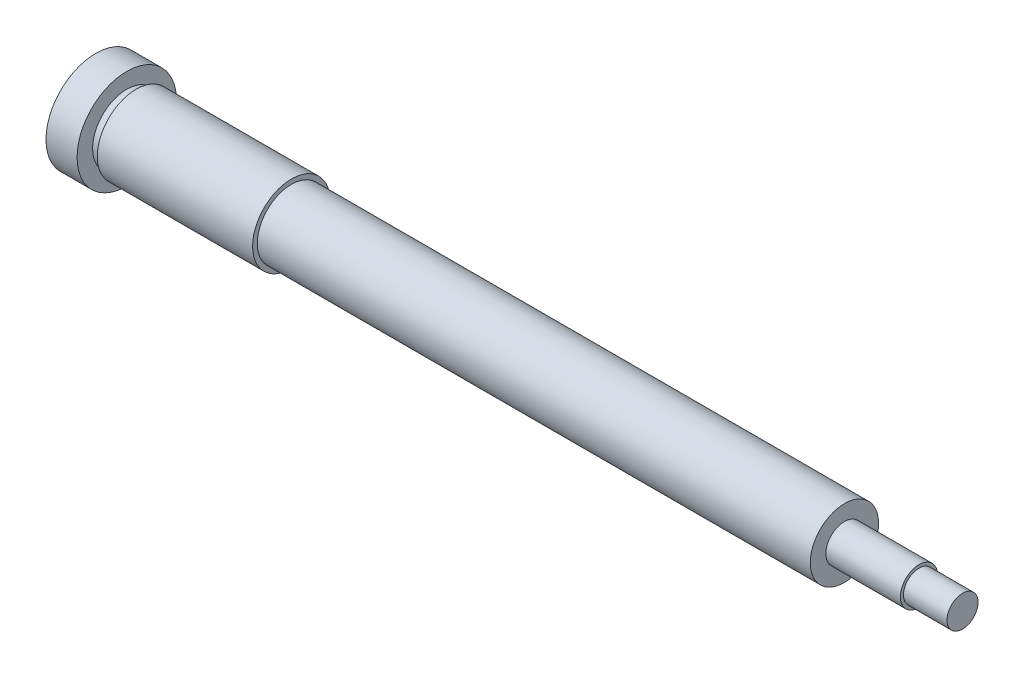
ISO-10303-21;
HEADER;
FILE_DESCRIPTION(('STEP AP214'),'2;1');
FILE_NAME('part.step','',(''),(''),'','','');
FILE_SCHEMA(('AUTOMOTIVE_DESIGN { 1 0 10303 214 1 1 1 1 }'));
ENDSEC;
DATA;
#1=APPLICATION_CONTEXT('core data for automotive mechanical design processes');
#2=APPLICATION_PROTOCOL_DEFINITION('international standard','automotive_design',2000,#1);
#3=PRODUCT_CONTEXT('',#1,'mechanical');
#4=PRODUCT('Part','Part','',(#3));
#5=PRODUCT_RELATED_PRODUCT_CATEGORY('part','',(#4));
#6=PRODUCT_DEFINITION_FORMATION('','',#4);
#7=PRODUCT_DEFINITION_CONTEXT('part definition',#1,'design');
#8=PRODUCT_DEFINITION('design','',#6,#7);
#9=PRODUCT_DEFINITION_SHAPE('','',#8);
#10=(LENGTH_UNIT() NAMED_UNIT(*) SI_UNIT(.MILLI.,.METRE.));
#11=(NAMED_UNIT(*) PLANE_ANGLE_UNIT() SI_UNIT($,.RADIAN.));
#12=(NAMED_UNIT(*) SI_UNIT($,.STERADIAN.) SOLID_ANGLE_UNIT());
#13=UNCERTAINTY_MEASURE_WITH_UNIT(LENGTH_MEASURE(1.E-05),#10,'distance_accuracy_value','');
#14=(GEOMETRIC_REPRESENTATION_CONTEXT(3) GLOBAL_UNCERTAINTY_ASSIGNED_CONTEXT((#13)) GLOBAL_UNIT_ASSIGNED_CONTEXT((#10,
#11,#12)) REPRESENTATION_CONTEXT('',''));
#15=CARTESIAN_POINT('',(0.,0.,0.));
#16=DIRECTION('',(0.,0.,1.));
#17=DIRECTION('',(1.,0.,0.));
#18=AXIS2_PLACEMENT_3D('',#15,#16,#17);
#19=CARTESIAN_POINT('',(-279.,0.,0.));
#20=DIRECTION('',(1.,0.,0.));
#21=DIRECTION('',(0.,0.,-1.));
#22=AXIS2_PLACEMENT_3D('',#19,#20,#21);
#23=PLANE('',#22);
#24=CARTESIAN_POINT('',(-279.,0.,0.));
#25=DIRECTION('',(-1.,0.,0.));
#26=DIRECTION('',(0.,0.,1.));
#27=AXIS2_PLACEMENT_3D('',#24,#25,#26);
#28=CIRCLE('',#27,16.);
#29=CARTESIAN_POINT('',(-279.,0.,16.));
#30=VERTEX_POINT('',#29);
#31=EDGE_CURVE('E10',#30,#30,#28,.T.);
#32=ORIENTED_EDGE('',*,*,#31,.T.);
#33=EDGE_LOOP('',(#32));
#34=FACE_BOUND('',#33,.T.);
#35=ADVANCED_FACE('F35',(#34),#23,.F.);
#36=CARTESIAN_POINT('',(-279.,0.,0.));
#37=DIRECTION('',(-1.,0.,0.));
#38=DIRECTION('',(0.,0.,1.));
#39=AXIS2_PLACEMENT_3D('',#36,#37,#38);
#40=CYLINDRICAL_SURFACE('',#39,16.);
#41=ORIENTED_EDGE('',*,*,#31,.F.);
#42=EDGE_LOOP('',(#41));
#43=FACE_BOUND('',#42,.T.);
#44=CARTESIAN_POINT('',(-269.,0.,0.));
#45=DIRECTION('',(-1.,0.,0.));
#46=DIRECTION('',(0.,0.,1.));
#47=AXIS2_PLACEMENT_3D('',#44,#45,#46);
#48=CIRCLE('',#47,16.);
#49=CARTESIAN_POINT('',(-269.,0.,16.));
#50=VERTEX_POINT('',#49);
#51=EDGE_CURVE('E41',#50,#50,#48,.T.);
#52=ORIENTED_EDGE('',*,*,#51,.T.);
#53=EDGE_LOOP('',(#52));
#54=FACE_BOUND('',#53,.T.);
#55=ADVANCED_FACE('F91',(#43,#54),#40,.T.);
#56=CARTESIAN_POINT('',(-269.,16.,0.));
#57=DIRECTION('',(-1.,0.,0.));
#58=DIRECTION('',(0.,0.,1.));
#59=AXIS2_PLACEMENT_3D('',#56,#57,#58);
#60=PLANE('',#59);
#61=ORIENTED_EDGE('',*,*,#51,.F.);
#62=EDGE_LOOP('',(#61));
#63=FACE_BOUND('',#62,.T.);
#64=CARTESIAN_POINT('',(-269.,0.,0.));
#65=DIRECTION('',(-1.,0.,0.));
#66=DIRECTION('',(0.,0.,1.));
#67=AXIS2_PLACEMENT_3D('',#64,#65,#66);
#68=CIRCLE('',#67,11.);
#69=CARTESIAN_POINT('',(-269.,0.,11.));
#70=VERTEX_POINT('',#69);
#71=EDGE_CURVE('E45',#70,#70,#68,.T.);
#72=ORIENTED_EDGE('',*,*,#71,.T.);
#73=EDGE_LOOP('',(#72));
#74=FACE_BOUND('',#73,.T.);
#75=ADVANCED_FACE('F95',(#63,#74),#60,.F.);
#76=CARTESIAN_POINT('',(-279.,0.,0.));
#77=DIRECTION('',(-1.,0.,0.));
#78=DIRECTION('',(0.,0.,1.));
#79=AXIS2_PLACEMENT_3D('',#76,#77,#78);
#80=CYLINDRICAL_SURFACE('',#79,11.);
#81=ORIENTED_EDGE('',*,*,#71,.F.);
#82=EDGE_LOOP('',(#81));
#83=FACE_BOUND('',#82,.T.);
#84=CARTESIAN_POINT('',(-266.,0.,0.));
#85=DIRECTION('',(-1.,0.,0.));
#86=DIRECTION('',(0.,0.,1.));
#87=AXIS2_PLACEMENT_3D('',#84,#85,#86);
#88=CIRCLE('',#87,11.);
#89=CARTESIAN_POINT('',(-266.,0.,11.));
#90=VERTEX_POINT('',#89);
#91=EDGE_CURVE('E49',#90,#90,#88,.T.);
#92=ORIENTED_EDGE('',*,*,#91,.T.);
#93=EDGE_LOOP('',(#92));
#94=FACE_BOUND('',#93,.T.);
#95=ADVANCED_FACE('F100',(#83,#94),#80,.T.);
#96=CARTESIAN_POINT('',(-266.,11.,0.));
#97=DIRECTION('',(1.,0.,0.));
#98=DIRECTION('',(0.,0.,-1.));
#99=AXIS2_PLACEMENT_3D('',#96,#97,#98);
#100=PLANE('',#99);
#101=ORIENTED_EDGE('',*,*,#91,.F.);
#102=EDGE_LOOP('',(#101));
#103=FACE_BOUND('',#102,.T.);
#104=CARTESIAN_POINT('',(-266.,0.,0.));
#105=DIRECTION('',(-1.,0.,0.));
#106=DIRECTION('',(0.,0.,1.));
#107=AXIS2_PLACEMENT_3D('',#104,#105,#106);
#108=CIRCLE('',#107,12.5);
#109=CARTESIAN_POINT('',(-266.,0.,12.5));
#110=VERTEX_POINT('',#109);
#111=EDGE_CURVE('E54',#110,#110,#108,.T.);
#112=ORIENTED_EDGE('',*,*,#111,.T.);
#113=EDGE_LOOP('',(#112));
#114=FACE_BOUND('',#113,.T.);
#115=ADVANCED_FACE('F106',(#103,#114),#100,.F.);
#116=CARTESIAN_POINT('',(-279.,0.,0.));
#117=DIRECTION('',(-1.,0.,0.));
#118=DIRECTION('',(0.,0.,1.));
#119=AXIS2_PLACEMENT_3D('',#116,#117,#118);
#120=CYLINDRICAL_SURFACE('',#119,12.5);
#121=ORIENTED_EDGE('',*,*,#111,.F.);
#122=EDGE_LOOP('',(#121));
#123=FACE_BOUND('',#122,.T.);
#124=CARTESIAN_POINT('',(-216.,0.,0.));
#125=DIRECTION('',(-1.,0.,0.));
#126=DIRECTION('',(0.,0.,1.));
#127=AXIS2_PLACEMENT_3D('',#124,#125,#126);
#128=CIRCLE('',#127,12.5);
#129=CARTESIAN_POINT('',(-216.,0.,12.5));
#130=VERTEX_POINT('',#129);
#131=EDGE_CURVE('E57',#130,#130,#128,.T.);
#132=ORIENTED_EDGE('',*,*,#131,.T.);
#133=EDGE_LOOP('',(#132));
#134=FACE_BOUND('',#133,.T.);
#135=ADVANCED_FACE('F110',(#123,#134),#120,.T.);
#136=CARTESIAN_POINT('',(-216.,12.5,0.));
#137=DIRECTION('',(-1.,0.,0.));
#138=DIRECTION('',(0.,0.,1.));
#139=AXIS2_PLACEMENT_3D('',#136,#137,#138);
#140=PLANE('',#139);
#141=ORIENTED_EDGE('',*,*,#131,.F.);
#142=EDGE_LOOP('',(#141));
#143=FACE_BOUND('',#142,.T.);
#144=CARTESIAN_POINT('',(-216.,0.,0.));
#145=DIRECTION('',(-1.,0.,0.));
#146=DIRECTION('',(0.,0.,1.));
#147=AXIS2_PLACEMENT_3D('',#144,#145,#146);
#148=CIRCLE('',#147,11.);
#149=CARTESIAN_POINT('',(-216.,0.,11.));
#150=VERTEX_POINT('',#149);
#151=EDGE_CURVE('E60',#150,#150,#148,.T.);
#152=ORIENTED_EDGE('',*,*,#151,.T.);
#153=EDGE_LOOP('',(#152));
#154=FACE_BOUND('',#153,.T.);
#155=ADVANCED_FACE('F114',(#143,#154),#140,.F.);
#156=CARTESIAN_POINT('',(-279.,0.,0.));
#157=DIRECTION('',(-1.,0.,0.));
#158=DIRECTION('',(0.,0.,1.));
#159=AXIS2_PLACEMENT_3D('',#156,#157,#158);
#160=CYLINDRICAL_SURFACE('',#159,11.);
#161=ORIENTED_EDGE('',*,*,#151,.F.);
#162=EDGE_LOOP('',(#161));
#163=FACE_BOUND('',#162,.T.);
#164=CARTESIAN_POINT('',(-38.,0.,0.));
#165=DIRECTION('',(-1.,0.,0.));
#166=DIRECTION('',(0.,0.,1.));
#167=AXIS2_PLACEMENT_3D('',#164,#165,#166);
#168=CIRCLE('',#167,11.);
#169=CARTESIAN_POINT('',(-38.,0.,11.));
#170=VERTEX_POINT('',#169);
#171=EDGE_CURVE('E63',#170,#170,#168,.T.);
#172=ORIENTED_EDGE('',*,*,#171,.T.);
#173=EDGE_LOOP('',(#172));
#174=FACE_BOUND('',#173,.T.);
#175=ADVANCED_FACE('F118',(#163,#174),#160,.T.);
#176=CARTESIAN_POINT('',(-38.,11.,0.));
#177=DIRECTION('',(-1.,0.,0.));
#178=DIRECTION('',(0.,0.,1.));
#179=AXIS2_PLACEMENT_3D('',#176,#177,#178);
#180=PLANE('',#179);
#181=ORIENTED_EDGE('',*,*,#171,.F.);
#182=EDGE_LOOP('',(#181));
#183=FACE_BOUND('',#182,.T.);
#184=CARTESIAN_POINT('',(-38.,0.,0.));
#185=DIRECTION('',(-1.,0.,0.));
#186=DIRECTION('',(0.,0.,1.));
#187=AXIS2_PLACEMENT_3D('',#184,#185,#186);
#188=CIRCLE('',#187,6.);
#189=CARTESIAN_POINT('',(-38.,0.,6.));
#190=VERTEX_POINT('',#189);
#191=EDGE_CURVE('E66',#190,#190,#188,.T.);
#192=ORIENTED_EDGE('',*,*,#191,.T.);
#193=EDGE_LOOP('',(#192));
#194=FACE_BOUND('',#193,.T.);
#195=ADVANCED_FACE('F122',(#183,#194),#180,.F.);
#196=CARTESIAN_POINT('',(-279.,0.,0.));
#197=DIRECTION('',(-1.,0.,0.));
#198=DIRECTION('',(0.,0.,1.));
#199=AXIS2_PLACEMENT_3D('',#196,#197,#198);
#200=CYLINDRICAL_SURFACE('',#199,6.);
#201=ORIENTED_EDGE('',*,*,#191,.F.);
#202=EDGE_LOOP('',(#201));
#203=FACE_BOUND('',#202,.T.);
#204=CARTESIAN_POINT('',(-14.,0.,0.));
#205=DIRECTION('',(-1.,0.,0.));
#206=DIRECTION('',(0.,0.,1.));
#207=AXIS2_PLACEMENT_3D('',#204,#205,#206);
#208=CIRCLE('',#207,6.00000000000001);
#209=CARTESIAN_POINT('',(-14.,0.,6.00000000000001));
#210=VERTEX_POINT('',#209);
#211=EDGE_CURVE('E69',#210,#210,#208,.T.);
#212=ORIENTED_EDGE('',*,*,#211,.T.);
#213=EDGE_LOOP('',(#212));
#214=FACE_BOUND('',#213,.T.);
#215=ADVANCED_FACE('F126',(#203,#214),#200,.T.);
#216=CARTESIAN_POINT('',(-14.,6.00000000000001,0.));
#217=DIRECTION('',(-1.,0.,0.));
#218=DIRECTION('',(0.,0.,1.));
#219=AXIS2_PLACEMENT_3D('',#216,#217,#218);
#220=PLANE('',#219);
#221=ORIENTED_EDGE('',*,*,#211,.F.);
#222=EDGE_LOOP('',(#221));
#223=FACE_BOUND('',#222,.T.);
#224=CARTESIAN_POINT('',(-14.,0.,0.));
#225=DIRECTION('',(-1.,0.,0.));
#226=DIRECTION('',(0.,0.,1.));
#227=AXIS2_PLACEMENT_3D('',#224,#225,#226);
#228=CIRCLE('',#227,5.);
#229=CARTESIAN_POINT('',(-14.,0.,5.));
#230=VERTEX_POINT('',#229);
#231=EDGE_CURVE('E72',#230,#230,#228,.T.);
#232=ORIENTED_EDGE('',*,*,#231,.T.);
#233=EDGE_LOOP('',(#232));
#234=FACE_BOUND('',#233,.T.);
#235=ADVANCED_FACE('F87',(#223,#234),#220,.F.);
#236=CARTESIAN_POINT('',(-279.,0.,0.));
#237=DIRECTION('',(-1.,0.,0.));
#238=DIRECTION('',(0.,0.,1.));
#239=AXIS2_PLACEMENT_3D('',#236,#237,#238);
#240=CYLINDRICAL_SURFACE('',#239,5.);
#241=ORIENTED_EDGE('',*,*,#231,.F.);
#242=EDGE_LOOP('',(#241));
#243=FACE_BOUND('',#242,.T.);
#244=CARTESIAN_POINT('',(0.,0.,0.));
#245=DIRECTION('',(-1.,0.,0.));
#246=DIRECTION('',(0.,0.,1.));
#247=AXIS2_PLACEMENT_3D('',#244,#245,#246);
#248=CIRCLE('',#247,5.);
#249=CARTESIAN_POINT('',(0.,0.,5.));
#250=VERTEX_POINT('',#249);
#251=EDGE_CURVE('E75',#250,#250,#248,.T.);
#252=ORIENTED_EDGE('',*,*,#251,.T.);
#253=EDGE_LOOP('',(#252));
#254=FACE_BOUND('',#253,.T.);
#255=ADVANCED_FACE('F79',(#243,#254),#240,.T.);
#256=CARTESIAN_POINT('',(0.,5.,0.));
#257=DIRECTION('',(-1.,0.,0.));
#258=DIRECTION('',(0.,0.,1.));
#259=AXIS2_PLACEMENT_3D('',#256,#257,#258);
#260=PLANE('',#259);
#261=ORIENTED_EDGE('',*,*,#251,.F.);
#262=EDGE_LOOP('',(#261));
#263=FACE_BOUND('',#262,.T.);
#264=ADVANCED_FACE('F81',(#263),#260,.F.);
#265=CLOSED_SHELL('',(#35,#55,#75,#95,#115,#135,#155,#175,#195,#215,#235,#255,#264));
#266=MANIFOLD_SOLID_BREP('B2',#265);
#267=ADVANCED_BREP_SHAPE_REPRESENTATION('',(#18,#266),#14);
#268=SHAPE_DEFINITION_REPRESENTATION(#9,#267);
ENDSEC;
END-ISO-10303-21;
